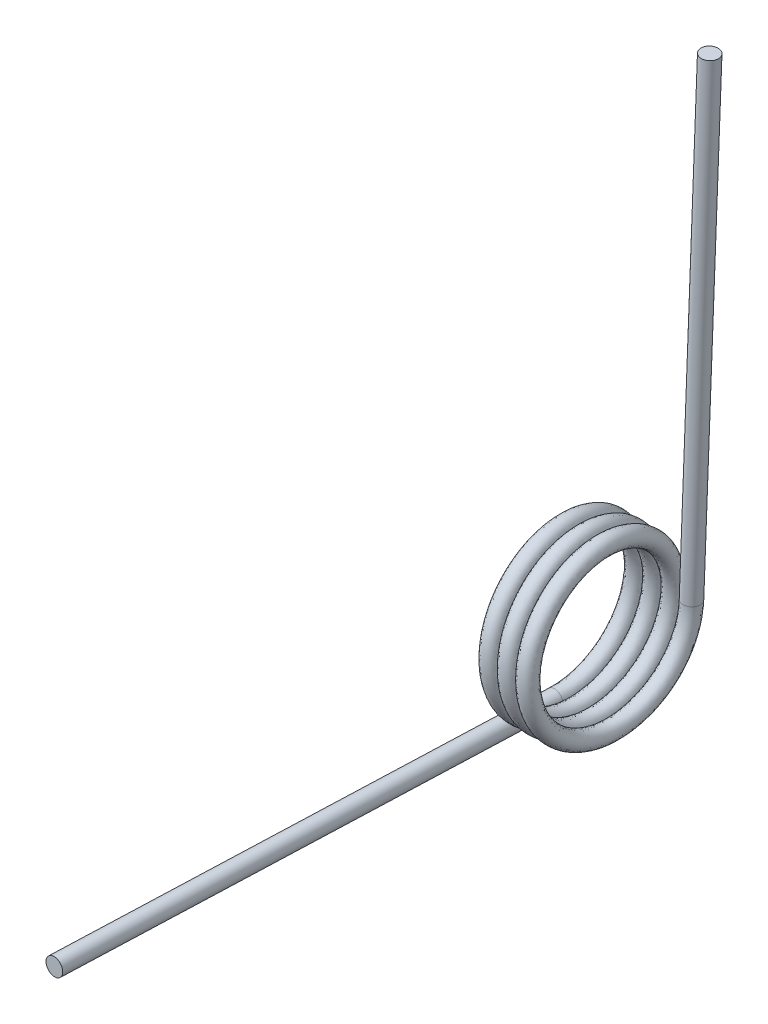
ISO-10303-21;
HEADER;
FILE_DESCRIPTION(('STEP AP214'),'2;1');
FILE_NAME('part.step','',(''),(''),'','','');
FILE_SCHEMA(('AUTOMOTIVE_DESIGN { 1 0 10303 214 1 1 1 1 }'));
ENDSEC;
DATA;
#1=APPLICATION_CONTEXT('core data for automotive mechanical design processes');
#2=APPLICATION_PROTOCOL_DEFINITION('international standard','automotive_design',2000,#1);
#3=PRODUCT_CONTEXT('',#1,'mechanical');
#4=PRODUCT('Part','Part','',(#3));
#5=PRODUCT_RELATED_PRODUCT_CATEGORY('part','',(#4));
#6=PRODUCT_DEFINITION_FORMATION('','',#4);
#7=PRODUCT_DEFINITION_CONTEXT('part definition',#1,'design');
#8=PRODUCT_DEFINITION('design','',#6,#7);
#9=PRODUCT_DEFINITION_SHAPE('','',#8);
#10=(LENGTH_UNIT() NAMED_UNIT(*) SI_UNIT(.MILLI.,.METRE.));
#11=(NAMED_UNIT(*) PLANE_ANGLE_UNIT() SI_UNIT($,.RADIAN.));
#12=(NAMED_UNIT(*) SI_UNIT($,.STERADIAN.) SOLID_ANGLE_UNIT());
#13=UNCERTAINTY_MEASURE_WITH_UNIT(LENGTH_MEASURE(1.E-05),#10,'distance_accuracy_value','');
#14=(GEOMETRIC_REPRESENTATION_CONTEXT(3) GLOBAL_UNCERTAINTY_ASSIGNED_CONTEXT((#13)) GLOBAL_UNIT_ASSIGNED_CONTEXT((#10,
#11,#12)) REPRESENTATION_CONTEXT('',''));
#15=CARTESIAN_POINT('',(0.,0.,0.));
#16=DIRECTION('',(0.,0.,1.));
#17=DIRECTION('',(1.,0.,0.));
#18=AXIS2_PLACEMENT_3D('',#15,#16,#17);
#19=CARTESIAN_POINT('',(-0.228436864439154,-2.032,-0.00863475333799859));
#20=CARTESIAN_POINT('',(-0.188220197772487,-2.02701472283592,-1.18181050033132));
#21=CARTESIAN_POINT('',(-0.148003531105821,-1.00852208425388,-1.76408099715898));
#22=CARTESIAN_POINT('',(-0.107786864439154,0.00997055432815887,-2.34635149398664));
#23=CARTESIAN_POINT('',(-0.0675701977724874,1.02347791574612,-1.75544624382098));
#24=CARTESIAN_POINT('',(-0.0273535311058208,2.03698527716408,-1.16454099365532));
#25=CARTESIAN_POINT('',(0.0128631355608458,2.032,0.00863475333799834));
#26=CARTESIAN_POINT('',(0.0530798022275124,2.02701472283592,1.18181050033132));
#27=CARTESIAN_POINT('',(0.0932964688941789,1.00852208425388,1.76408099715898));
#28=CARTESIAN_POINT('',(0.133513135560846,-0.00997055432815858,2.34635149398664));
#29=CARTESIAN_POINT('',(0.173729802227512,-1.02347791574612,1.75544624382098));
#30=CARTESIAN_POINT('',(0.213946468894179,-2.03698527716408,1.16454099365532));
#31=CARTESIAN_POINT('',(0.254163135560845,-2.032,-0.00863475333799859));
#32=CARTESIAN_POINT('',(0.294379802227512,-2.02701472283592,-1.18181050033132));
#33=CARTESIAN_POINT('',(0.334596468894178,-1.00852208425388,-1.76408099715898));
#34=CARTESIAN_POINT('',(0.374813135560845,0.00997055432815887,-2.34635149398664));
#35=CARTESIAN_POINT('',(0.415029802227512,1.02347791574612,-1.75544624382098));
#36=CARTESIAN_POINT('',(0.455246468894178,2.03698527716408,-1.16454099365532));
#37=CARTESIAN_POINT('',(0.495463135560845,2.032,0.00863475333799834));
#38=CARTESIAN_POINT('',(0.535679802227511,2.02701472283592,1.18181050033132));
#39=CARTESIAN_POINT('',(0.575896468894178,1.00852208425388,1.76408099715898));
#40=CARTESIAN_POINT('',(0.616113135560844,-0.00997055432815858,2.34635149398664));
#41=CARTESIAN_POINT('',(0.656329802227511,-1.02347791574612,1.75544624382098));
#42=CARTESIAN_POINT('',(0.696546468894178,-2.03698527716408,1.16454099365532));
#43=CARTESIAN_POINT('',(0.736763135560844,-2.032,-0.00863475333799859));
#44=CARTESIAN_POINT('',(0.776979802227511,-2.02701472283592,-1.18181050033132));
#45=CARTESIAN_POINT('',(0.817196468894177,-1.00852208425388,-1.76408099715898));
#46=CARTESIAN_POINT('',(0.857413135560844,0.00997055432815887,-2.34635149398664));
#47=CARTESIAN_POINT('',(0.897629802227511,1.02347791574612,-1.75544624382098));
#48=CARTESIAN_POINT('',(0.937846468894177,2.03698527716408,-1.16454099365532));
#49=CARTESIAN_POINT('',(0.978063135560844,2.032,0.00863475333799834));
#50=CARTESIAN_POINT('',(1.01827980222751,2.02701472283592,1.18181050033132));
#51=CARTESIAN_POINT('',(1.05849646889418,1.00852208425388,1.76408099715898));
#52=CARTESIAN_POINT('',(1.09871313556084,-0.00997055432815858,2.34635149398664));
#53=CARTESIAN_POINT('',(1.13892980222751,-1.02347791574612,1.75544624382098));
#54=CARTESIAN_POINT('',(1.17914646889418,-2.03698527716408,1.16454099365532));
#55=CARTESIAN_POINT('',(1.21936313556084,-2.032,-0.00863475333799859));
#56=CARTESIAN_POINT('',(1.25957980222751,-2.02701472283592,-1.18181050033132));
#57=CARTESIAN_POINT('',(1.29979646889418,-1.00852208425388,-1.76408099715898));
#58=CARTESIAN_POINT('',(1.34001313556084,0.00997055432815887,-2.34635149398664));
#59=CARTESIAN_POINT('',(1.38022980222751,1.02347791574612,-1.75544624382098));
#60=CARTESIAN_POINT('',(1.42044646889418,2.03698527716408,-1.16454099365532));
#61=CARTESIAN_POINT('',(1.46066313556084,2.032,0.00863475333799834));
#62=CARTESIAN_POINT('',(1.50087980222751,2.02701472283592,1.18181050033132));
#63=CARTESIAN_POINT('',(1.54109646889418,1.00852208425388,1.76408099715898));
#64=CARTESIAN_POINT('',(1.58131313556084,-0.00997055432815858,2.34635149398664));
#65=CARTESIAN_POINT('',(1.62152980222751,-1.02347791574612,1.75544624382098));
#66=CARTESIAN_POINT('',(1.66174646889418,-2.03698527716408,1.16454099365532));
#67=CARTESIAN_POINT('',(1.70196313556084,-2.032,-0.00863475333799859));
#68=CARTESIAN_POINT('',(-0.228436864439154,-1.5748,-0.00863475333799345));
#69=CARTESIAN_POINT('',(-0.188220197772487,-1.56981472283592,-0.917845957257816));
#70=CARTESIAN_POINT('',(-0.148003531105821,-0.779922084253885,-1.36813418254873));
#71=CARTESIAN_POINT('',(-0.107786864439154,0.00997055432815296,-1.81842240783965));
#72=CARTESIAN_POINT('',(-0.0675701977724875,0.794877915746114,-1.35949942921074));
#73=CARTESIAN_POINT('',(-0.027353531105821,1.57978527716408,-0.90057645058183));
#74=CARTESIAN_POINT('',(0.0128631355608456,1.5748,0.00863475333799325));
#75=CARTESIAN_POINT('',(0.0530798022275122,1.56981472283592,0.917845957257816));
#76=CARTESIAN_POINT('',(0.0932964688941788,0.779922084253886,1.36813418254873));
#77=CARTESIAN_POINT('',(0.133513135560845,-0.00997055432815274,1.81842240783965));
#78=CARTESIAN_POINT('',(0.173729802227512,-0.794877915746114,1.35949942921074));
#79=CARTESIAN_POINT('',(0.213946468894178,-1.57978527716408,0.90057645058183));
#80=CARTESIAN_POINT('',(0.254163135560845,-1.5748,-0.00863475333799345));
#81=CARTESIAN_POINT('',(0.294379802227512,-1.56981472283592,-0.917845957257816));
#82=CARTESIAN_POINT('',(0.334596468894178,-0.779922084253885,-1.36813418254873));
#83=CARTESIAN_POINT('',(0.374813135560845,0.00997055432815296,-1.81842240783965));
#84=CARTESIAN_POINT('',(0.415029802227511,0.794877915746114,-1.35949942921074));
#85=CARTESIAN_POINT('',(0.455246468894178,1.57978527716408,-0.90057645058183));
#86=CARTESIAN_POINT('',(0.495463135560844,1.5748,0.00863475333799325));
#87=CARTESIAN_POINT('',(0.535679802227511,1.56981472283592,0.917845957257816));
#88=CARTESIAN_POINT('',(0.575896468894178,0.779922084253886,1.36813418254873));
#89=CARTESIAN_POINT('',(0.616113135560844,-0.00997055432815274,1.81842240783965));
#90=CARTESIAN_POINT('',(0.656329802227511,-0.794877915746114,1.35949942921074));
#91=CARTESIAN_POINT('',(0.696546468894177,-1.57978527716408,0.90057645058183));
#92=CARTESIAN_POINT('',(0.736763135560844,-1.5748,-0.00863475333799345));
#93=CARTESIAN_POINT('',(0.776979802227511,-1.56981472283592,-0.917845957257816));
#94=CARTESIAN_POINT('',(0.817196468894177,-0.779922084253885,-1.36813418254873));
#95=CARTESIAN_POINT('',(0.857413135560844,0.00997055432815296,-1.81842240783965));
#96=CARTESIAN_POINT('',(0.89762980222751,0.794877915746114,-1.35949942921074));
#97=CARTESIAN_POINT('',(0.937846468894177,1.57978527716408,-0.90057645058183));
#98=CARTESIAN_POINT('',(0.978063135560844,1.5748,0.00863475333799325));
#99=CARTESIAN_POINT('',(1.01827980222751,1.56981472283592,0.917845957257816));
#100=CARTESIAN_POINT('',(1.05849646889418,0.779922084253886,1.36813418254873));
#101=CARTESIAN_POINT('',(1.09871313556084,-0.00997055432815274,1.81842240783965));
#102=CARTESIAN_POINT('',(1.13892980222751,-0.794877915746114,1.35949942921074));
#103=CARTESIAN_POINT('',(1.17914646889418,-1.57978527716408,0.90057645058183));
#104=CARTESIAN_POINT('',(1.21936313556084,-1.5748,-0.00863475333799345));
#105=CARTESIAN_POINT('',(1.25957980222751,-1.56981472283592,-0.917845957257816));
#106=CARTESIAN_POINT('',(1.29979646889418,-0.779922084253885,-1.36813418254873));
#107=CARTESIAN_POINT('',(1.34001313556084,0.00997055432815296,-1.81842240783965));
#108=CARTESIAN_POINT('',(1.38022980222751,0.794877915746114,-1.35949942921074));
#109=CARTESIAN_POINT('',(1.42044646889418,1.57978527716408,-0.90057645058183));
#110=CARTESIAN_POINT('',(1.46066313556084,1.5748,0.00863475333799325));
#111=CARTESIAN_POINT('',(1.50087980222751,1.56981472283592,0.917845957257816));
#112=CARTESIAN_POINT('',(1.54109646889418,0.779922084253886,1.36813418254873));
#113=CARTESIAN_POINT('',(1.58131313556084,-0.00997055432815274,1.81842240783965));
#114=CARTESIAN_POINT('',(1.62152980222751,-0.794877915746114,1.35949942921074));
#115=CARTESIAN_POINT('',(1.66174646889418,-1.57978527716408,0.90057645058183));
#116=CARTESIAN_POINT('',(1.70196313556084,-1.5748,-0.00863475333799345));
#117=CARTESIAN_POINT('',(0.228436864439154,-1.5748,0.00863475333796116));
#118=CARTESIAN_POINT('',(0.26865353110582,-1.57978527716406,-0.900576450581861));
#119=CARTESIAN_POINT('',(0.308870197772487,-0.794877915746087,-1.35949942921075));
#120=CARTESIAN_POINT('',(0.349086864439153,-0.00997055432811591,-1.81842240783965));
#121=CARTESIAN_POINT('',(0.38930353110582,0.779922084253913,-1.36813418254871));
#122=CARTESIAN_POINT('',(0.429520197772486,1.56981472283594,-0.917845957257784));
#123=CARTESIAN_POINT('',(0.469736864439153,1.5748,-0.00863475333796136));
#124=CARTESIAN_POINT('',(0.50995353110582,1.57978527716406,0.900576450581861));
#125=CARTESIAN_POINT('',(0.550170197772486,0.794877915746087,1.35949942921075));
#126=CARTESIAN_POINT('',(0.590386864439153,0.00997055432811613,1.81842240783965));
#127=CARTESIAN_POINT('',(0.630603531105819,-0.779922084253912,1.36813418254871));
#128=CARTESIAN_POINT('',(0.670820197772486,-1.56981472283594,0.917845957257785));
#129=CARTESIAN_POINT('',(0.711036864439152,-1.5748,0.00863475333796116));
#130=CARTESIAN_POINT('',(0.751253531105819,-1.57978527716406,-0.900576450581861));
#131=CARTESIAN_POINT('',(0.791470197772486,-0.794877915746087,-1.35949942921075));
#132=CARTESIAN_POINT('',(0.831686864439152,-0.00997055432811591,-1.81842240783965));
#133=CARTESIAN_POINT('',(0.871903531105819,0.779922084253913,-1.36813418254871));
#134=CARTESIAN_POINT('',(0.912120197772485,1.56981472283594,-0.917845957257784));
#135=CARTESIAN_POINT('',(0.952336864439152,1.5748,-0.00863475333796136));
#136=CARTESIAN_POINT('',(0.992553531105819,1.57978527716406,0.900576450581861));
#137=CARTESIAN_POINT('',(1.03277019777249,0.794877915746087,1.35949942921075));
#138=CARTESIAN_POINT('',(1.07298686443915,0.00997055432811613,1.81842240783965));
#139=CARTESIAN_POINT('',(1.11320353110582,-0.779922084253912,1.36813418254871));
#140=CARTESIAN_POINT('',(1.15342019777248,-1.56981472283594,0.917845957257785));
#141=CARTESIAN_POINT('',(1.19363686443915,-1.5748,0.00863475333796116));
#142=CARTESIAN_POINT('',(1.23385353110582,-1.57978527716406,-0.900576450581861));
#143=CARTESIAN_POINT('',(1.27407019777248,-0.794877915746087,-1.35949942921075));
#144=CARTESIAN_POINT('',(1.31428686443915,-0.00997055432811591,-1.81842240783965));
#145=CARTESIAN_POINT('',(1.35450353110582,0.779922084253913,-1.36813418254871));
#146=CARTESIAN_POINT('',(1.39472019777248,1.56981472283594,-0.917845957257784));
#147=CARTESIAN_POINT('',(1.43493686443915,1.5748,-0.00863475333796136));
#148=CARTESIAN_POINT('',(1.47515353110582,1.57978527716406,0.900576450581861));
#149=CARTESIAN_POINT('',(1.51537019777248,0.794877915746087,1.35949942921075));
#150=CARTESIAN_POINT('',(1.55558686443915,0.00997055432811613,1.81842240783965));
#151=CARTESIAN_POINT('',(1.59580353110582,-0.779922084253912,1.36813418254871));
#152=CARTESIAN_POINT('',(1.63602019777248,-1.56981472283594,0.917845957257785));
#153=CARTESIAN_POINT('',(1.67623686443915,-1.5748,0.00863475333796116));
#154=CARTESIAN_POINT('',(1.71645353110582,-1.57978527716406,-0.900576450581861));
#155=CARTESIAN_POINT('',(1.75667019777248,-0.794877915746087,-1.35949942921075));
#156=CARTESIAN_POINT('',(1.79688686443915,-0.00997055432811591,-1.81842240783965));
#157=CARTESIAN_POINT('',(1.83710353110582,0.779922084253913,-1.36813418254871));
#158=CARTESIAN_POINT('',(1.87732019777248,1.56981472283594,-0.917845957257784));
#159=CARTESIAN_POINT('',(1.91753686443915,1.5748,-0.00863475333796136));
#160=CARTESIAN_POINT('',(1.95775353110582,1.57978527716406,0.900576450581861));
#161=CARTESIAN_POINT('',(1.99797019777248,0.794877915746087,1.35949942921075));
#162=CARTESIAN_POINT('',(2.03818686443915,0.00997055432811613,1.81842240783965));
#163=CARTESIAN_POINT('',(2.07840353110582,-0.779922084253912,1.36813418254871));
#164=CARTESIAN_POINT('',(2.11862019777248,-1.56981472283594,0.917845957257785));
#165=CARTESIAN_POINT('',(2.15883686443915,-1.5748,0.00863475333796116));
#166=CARTESIAN_POINT('',(0.228436864439154,-2.032,0.00863475333795602));
#167=CARTESIAN_POINT('',(0.26865353110582,-2.03698527716405,-1.16454099365536));
#168=CARTESIAN_POINT('',(0.308870197772487,-1.02347791574608,-1.755446243821));
#169=CARTESIAN_POINT('',(0.349086864439153,-0.00997055432811,-2.34635149398664));
#170=CARTESIAN_POINT('',(0.38930353110582,1.00852208425392,-1.76408099715896));
#171=CARTESIAN_POINT('',(0.429520197772487,2.02701472283594,-1.18181050033128));
#172=CARTESIAN_POINT('',(0.469736864439153,2.032,-0.00863475333795627));
#173=CARTESIAN_POINT('',(0.50995353110582,2.03698527716406,1.16454099365536));
#174=CARTESIAN_POINT('',(0.550170197772486,1.02347791574608,1.755446243821));
#175=CARTESIAN_POINT('',(0.590386864439153,0.00997055432811028,2.34635149398664));
#176=CARTESIAN_POINT('',(0.630603531105819,-1.00852208425392,1.76408099715896));
#177=CARTESIAN_POINT('',(0.670820197772486,-2.02701472283594,1.18181050033128));
#178=CARTESIAN_POINT('',(0.711036864439153,-2.032,0.00863475333795602));
#179=CARTESIAN_POINT('',(0.751253531105819,-2.03698527716405,-1.16454099365536));
#180=CARTESIAN_POINT('',(0.791470197772486,-1.02347791574608,-1.755446243821));
#181=CARTESIAN_POINT('',(0.831686864439152,-0.00997055432811,-2.34635149398664));
#182=CARTESIAN_POINT('',(0.871903531105819,1.00852208425392,-1.76408099715896));
#183=CARTESIAN_POINT('',(0.912120197772485,2.02701472283594,-1.18181050033128));
#184=CARTESIAN_POINT('',(0.952336864439152,2.032,-0.00863475333795627));
#185=CARTESIAN_POINT('',(0.992553531105819,2.03698527716406,1.16454099365536));
#186=CARTESIAN_POINT('',(1.03277019777249,1.02347791574608,1.755446243821));
#187=CARTESIAN_POINT('',(1.07298686443915,0.00997055432811028,2.34635149398664));
#188=CARTESIAN_POINT('',(1.11320353110582,-1.00852208425392,1.76408099715896));
#189=CARTESIAN_POINT('',(1.15342019777248,-2.02701472283594,1.18181050033128));
#190=CARTESIAN_POINT('',(1.19363686443915,-2.032,0.00863475333795602));
#191=CARTESIAN_POINT('',(1.23385353110582,-2.03698527716405,-1.16454099365536));
#192=CARTESIAN_POINT('',(1.27407019777248,-1.02347791574608,-1.755446243821));
#193=CARTESIAN_POINT('',(1.31428686443915,-0.00997055432811,-2.34635149398664));
#194=CARTESIAN_POINT('',(1.35450353110582,1.00852208425392,-1.76408099715896));
#195=CARTESIAN_POINT('',(1.39472019777248,2.02701472283594,-1.18181050033128));
#196=CARTESIAN_POINT('',(1.43493686443915,2.032,-0.00863475333795627));
#197=CARTESIAN_POINT('',(1.47515353110582,2.03698527716406,1.16454099365536));
#198=CARTESIAN_POINT('',(1.51537019777248,1.02347791574608,1.755446243821));
#199=CARTESIAN_POINT('',(1.55558686443915,0.00997055432811028,2.34635149398664));
#200=CARTESIAN_POINT('',(1.59580353110582,-1.00852208425392,1.76408099715896));
#201=CARTESIAN_POINT('',(1.63602019777248,-2.02701472283594,1.18181050033128));
#202=CARTESIAN_POINT('',(1.67623686443915,-2.032,0.00863475333795602));
#203=CARTESIAN_POINT('',(1.71645353110582,-2.03698527716405,-1.16454099365536));
#204=CARTESIAN_POINT('',(1.75667019777248,-1.02347791574608,-1.755446243821));
#205=CARTESIAN_POINT('',(1.79688686443915,-0.00997055432811,-2.34635149398664));
#206=CARTESIAN_POINT('',(1.83710353110582,1.00852208425392,-1.76408099715896));
#207=CARTESIAN_POINT('',(1.87732019777248,2.02701472283594,-1.18181050033128));
#208=CARTESIAN_POINT('',(1.91753686443915,2.032,-0.00863475333795627));
#209=CARTESIAN_POINT('',(1.95775353110582,2.03698527716406,1.16454099365536));
#210=CARTESIAN_POINT('',(1.99797019777248,1.02347791574608,1.755446243821));
#211=CARTESIAN_POINT('',(2.03818686443915,0.00997055432811028,2.34635149398664));
#212=CARTESIAN_POINT('',(2.07840353110582,-1.00852208425392,1.76408099715896));
#213=CARTESIAN_POINT('',(2.11862019777248,-2.02701472283594,1.18181050033128));
#214=CARTESIAN_POINT('',(2.15883686443915,-2.032,0.00863475333795602));
#215=CARTESIAN_POINT('',(0.228436864439154,-2.4892,0.00863475333795088));
#216=CARTESIAN_POINT('',(0.268653531105821,-2.49418527716405,-1.42850553672887));
#217=CARTESIAN_POINT('',(0.308870197772487,-1.25207791574608,-2.15139305843125));
#218=CARTESIAN_POINT('',(0.349086864439154,-0.00997055432810409,-2.87428058013363));
#219=CARTESIAN_POINT('',(0.38930353110582,1.23712208425392,-2.1600278117692));
#220=CARTESIAN_POINT('',(0.429520197772487,2.48421472283595,-1.44577504340477));
#221=CARTESIAN_POINT('',(0.469736864439154,2.4892,-0.00863475333795118));
#222=CARTESIAN_POINT('',(0.50995353110582,2.49418527716405,1.42850553672887));
#223=CARTESIAN_POINT('',(0.550170197772487,1.25207791574608,2.15139305843125));
#224=CARTESIAN_POINT('',(0.590386864439153,0.00997055432810444,2.87428058013363));
#225=CARTESIAN_POINT('',(0.63060353110582,-1.23712208425392,2.1600278117692));
#226=CARTESIAN_POINT('',(0.670820197772486,-2.48421472283595,1.44577504340477));
#227=CARTESIAN_POINT('',(0.711036864439153,-2.4892,0.00863475333795088));
#228=CARTESIAN_POINT('',(0.751253531105819,-2.49418527716405,-1.42850553672887));
#229=CARTESIAN_POINT('',(0.791470197772486,-1.25207791574608,-2.15139305843125));
#230=CARTESIAN_POINT('',(0.831686864439153,-0.00997055432810409,-2.87428058013363));
#231=CARTESIAN_POINT('',(0.871903531105819,1.23712208425392,-2.1600278117692));
#232=CARTESIAN_POINT('',(0.912120197772486,2.48421472283595,-1.44577504340477));
#233=CARTESIAN_POINT('',(0.952336864439152,2.4892,-0.00863475333795118));
#234=CARTESIAN_POINT('',(0.992553531105819,2.49418527716405,1.42850553672887));
#235=CARTESIAN_POINT('',(1.03277019777249,1.25207791574608,2.15139305843125));
#236=CARTESIAN_POINT('',(1.07298686443915,0.00997055432810444,2.87428058013363));
#237=CARTESIAN_POINT('',(1.11320353110582,-1.23712208425392,2.1600278117692));
#238=CARTESIAN_POINT('',(1.15342019777249,-2.48421472283595,1.44577504340477));
#239=CARTESIAN_POINT('',(1.19363686443915,-2.4892,0.00863475333795088));
#240=CARTESIAN_POINT('',(1.23385353110582,-2.49418527716405,-1.42850553672887));
#241=CARTESIAN_POINT('',(1.27407019777249,-1.25207791574608,-2.15139305843125));
#242=CARTESIAN_POINT('',(1.31428686443915,-0.00997055432810409,-2.87428058013363));
#243=CARTESIAN_POINT('',(1.35450353110582,1.23712208425392,-2.1600278117692));
#244=CARTESIAN_POINT('',(1.39472019777249,2.48421472283595,-1.44577504340477));
#245=CARTESIAN_POINT('',(1.43493686443915,2.4892,-0.00863475333795118));
#246=CARTESIAN_POINT('',(1.47515353110582,2.49418527716405,1.42850553672887));
#247=CARTESIAN_POINT('',(1.51537019777248,1.25207791574608,2.15139305843125));
#248=CARTESIAN_POINT('',(1.55558686443915,0.00997055432810444,2.87428058013363));
#249=CARTESIAN_POINT('',(1.59580353110582,-1.23712208425392,2.1600278117692));
#250=CARTESIAN_POINT('',(1.63602019777248,-2.48421472283595,1.44577504340477));
#251=CARTESIAN_POINT('',(1.67623686443915,-2.4892,0.00863475333795088));
#252=CARTESIAN_POINT('',(1.71645353110582,-2.49418527716405,-1.42850553672887));
#253=CARTESIAN_POINT('',(1.75667019777248,-1.25207791574608,-2.15139305843125));
#254=CARTESIAN_POINT('',(1.79688686443915,-0.00997055432810409,-2.87428058013363));
#255=CARTESIAN_POINT('',(1.83710353110582,1.23712208425392,-2.1600278117692));
#256=CARTESIAN_POINT('',(1.87732019777248,2.48421472283595,-1.44577504340477));
#257=CARTESIAN_POINT('',(1.91753686443915,2.4892,-0.00863475333795118));
#258=CARTESIAN_POINT('',(1.95775353110582,2.49418527716405,1.42850553672887));
#259=CARTESIAN_POINT('',(1.99797019777248,1.25207791574608,2.15139305843125));
#260=CARTESIAN_POINT('',(2.03818686443915,0.00997055432810444,2.87428058013363));
#261=CARTESIAN_POINT('',(2.07840353110582,-1.23712208425392,2.1600278117692));
#262=CARTESIAN_POINT('',(2.11862019777248,-2.48421472283595,1.44577504340477));
#263=CARTESIAN_POINT('',(2.15883686443915,-2.4892,0.00863475333795088));
#264=CARTESIAN_POINT('',(-0.228436864439154,-2.4892,-0.00863475333800374));
#265=CARTESIAN_POINT('',(-0.188220197772487,-2.48421472283592,-1.44577504340482));
#266=CARTESIAN_POINT('',(-0.14800353110582,-1.23712208425388,-2.16002781176923));
#267=CARTESIAN_POINT('',(-0.107786864439154,0.00997055432816478,-2.87428058013363));
#268=CARTESIAN_POINT('',(-0.0675701977724872,1.25207791574612,-2.15139305843122));
#269=CARTESIAN_POINT('',(-0.0273535311058206,2.49418527716408,-1.42850553672881));
#270=CARTESIAN_POINT('',(0.012863135560846,2.4892,0.00863475333800343));
#271=CARTESIAN_POINT('',(0.0530798022275125,2.48421472283592,1.44577504340482));
#272=CARTESIAN_POINT('',(0.0932964688941791,1.23712208425388,2.16002781176923));
#273=CARTESIAN_POINT('',(0.133513135560846,-0.00997055432816442,2.87428058013363));
#274=CARTESIAN_POINT('',(0.173729802227512,-1.25207791574612,2.15139305843122));
#275=CARTESIAN_POINT('',(0.213946468894179,-2.49418527716408,1.42850553672881));
#276=CARTESIAN_POINT('',(0.254163135560845,-2.4892,-0.00863475333800374));
#277=CARTESIAN_POINT('',(0.294379802227512,-2.48421472283592,-1.44577504340482));
#278=CARTESIAN_POINT('',(0.334596468894179,-1.23712208425388,-2.16002781176923));
#279=CARTESIAN_POINT('',(0.374813135560845,0.00997055432816478,-2.87428058013363));
#280=CARTESIAN_POINT('',(0.415029802227512,1.25207791574612,-2.15139305843122));
#281=CARTESIAN_POINT('',(0.455246468894178,2.49418527716408,-1.42850553672881));
#282=CARTESIAN_POINT('',(0.495463135560845,2.4892,0.00863475333800343));
#283=CARTESIAN_POINT('',(0.535679802227511,2.48421472283592,1.44577504340482));
#284=CARTESIAN_POINT('',(0.575896468894178,1.23712208425388,2.16002781176923));
#285=CARTESIAN_POINT('',(0.616113135560845,-0.00997055432816442,2.87428058013363));
#286=CARTESIAN_POINT('',(0.656329802227511,-1.25207791574612,2.15139305843122));
#287=CARTESIAN_POINT('',(0.696546468894178,-2.49418527716408,1.42850553672881));
#288=CARTESIAN_POINT('',(0.736763135560844,-2.4892,-0.00863475333800374));
#289=CARTESIAN_POINT('',(0.776979802227511,-2.48421472283592,-1.44577504340482));
#290=CARTESIAN_POINT('',(0.817196468894177,-1.23712208425388,-2.16002781176923));
#291=CARTESIAN_POINT('',(0.857413135560844,0.00997055432816478,-2.87428058013363));
#292=CARTESIAN_POINT('',(0.897629802227511,1.25207791574612,-2.15139305843122));
#293=CARTESIAN_POINT('',(0.937846468894177,2.49418527716408,-1.42850553672881));
#294=CARTESIAN_POINT('',(0.978063135560844,2.4892,0.00863475333800343));
#295=CARTESIAN_POINT('',(1.01827980222751,2.48421472283592,1.44577504340482));
#296=CARTESIAN_POINT('',(1.05849646889418,1.23712208425388,2.16002781176923));
#297=CARTESIAN_POINT('',(1.09871313556084,-0.00997055432816442,2.87428058013363));
#298=CARTESIAN_POINT('',(1.13892980222751,-1.25207791574612,2.15139305843122));
#299=CARTESIAN_POINT('',(1.17914646889418,-2.49418527716408,1.42850553672881));
#300=CARTESIAN_POINT('',(1.21936313556084,-2.4892,-0.00863475333800374));
#301=CARTESIAN_POINT('',(1.25957980222751,-2.48421472283592,-1.44577504340482));
#302=CARTESIAN_POINT('',(1.29979646889418,-1.23712208425388,-2.16002781176923));
#303=CARTESIAN_POINT('',(1.34001313556084,0.00997055432816478,-2.87428058013363));
#304=CARTESIAN_POINT('',(1.38022980222751,1.25207791574612,-2.15139305843122));
#305=CARTESIAN_POINT('',(1.42044646889418,2.49418527716408,-1.42850553672881));
#306=CARTESIAN_POINT('',(1.46066313556084,2.4892,0.00863475333800343));
#307=CARTESIAN_POINT('',(1.50087980222751,2.48421472283592,1.44577504340482));
#308=CARTESIAN_POINT('',(1.54109646889418,1.23712208425388,2.16002781176923));
#309=CARTESIAN_POINT('',(1.58131313556084,-0.00997055432816442,2.87428058013363));
#310=CARTESIAN_POINT('',(1.62152980222751,-1.25207791574612,2.15139305843122));
#311=CARTESIAN_POINT('',(1.66174646889418,-2.49418527716408,1.42850553672881));
#312=CARTESIAN_POINT('',(1.70196313556084,-2.4892,-0.00863475333800374));
#313=CARTESIAN_POINT('',(-0.228436864439154,-2.032,-0.00863475333799859));
#314=CARTESIAN_POINT('',(-0.188220197772487,-2.02701472283592,-1.18181050033132));
#315=CARTESIAN_POINT('',(-0.148003531105821,-1.00852208425388,-1.76408099715898));
#316=CARTESIAN_POINT('',(-0.107786864439154,0.00997055432815887,-2.34635149398664));
#317=CARTESIAN_POINT('',(-0.0675701977724874,1.02347791574612,-1.75544624382098));
#318=CARTESIAN_POINT('',(-0.0273535311058208,2.03698527716408,-1.16454099365532));
#319=CARTESIAN_POINT('',(0.0128631355608458,2.032,0.00863475333799834));
#320=CARTESIAN_POINT('',(0.0530798022275124,2.02701472283592,1.18181050033132));
#321=CARTESIAN_POINT('',(0.0932964688941789,1.00852208425388,1.76408099715898));
#322=CARTESIAN_POINT('',(0.133513135560846,-0.00997055432815858,2.34635149398664));
#323=CARTESIAN_POINT('',(0.173729802227512,-1.02347791574612,1.75544624382098));
#324=CARTESIAN_POINT('',(0.213946468894179,-2.03698527716408,1.16454099365532));
#325=CARTESIAN_POINT('',(0.254163135560845,-2.032,-0.00863475333799859));
#326=CARTESIAN_POINT('',(0.294379802227512,-2.02701472283592,-1.18181050033132));
#327=CARTESIAN_POINT('',(0.334596468894178,-1.00852208425388,-1.76408099715898));
#328=CARTESIAN_POINT('',(0.374813135560845,0.00997055432815887,-2.34635149398664));
#329=CARTESIAN_POINT('',(0.415029802227512,1.02347791574612,-1.75544624382098));
#330=CARTESIAN_POINT('',(0.455246468894178,2.03698527716408,-1.16454099365532));
#331=CARTESIAN_POINT('',(0.495463135560845,2.032,0.00863475333799834));
#332=CARTESIAN_POINT('',(0.535679802227511,2.02701472283592,1.18181050033132));
#333=CARTESIAN_POINT('',(0.575896468894178,1.00852208425388,1.76408099715898));
#334=CARTESIAN_POINT('',(0.616113135560844,-0.00997055432815858,2.34635149398664));
#335=CARTESIAN_POINT('',(0.656329802227511,-1.02347791574612,1.75544624382098));
#336=CARTESIAN_POINT('',(0.696546468894178,-2.03698527716408,1.16454099365532));
#337=CARTESIAN_POINT('',(0.736763135560844,-2.032,-0.00863475333799859));
#338=CARTESIAN_POINT('',(0.776979802227511,-2.02701472283592,-1.18181050033132));
#339=CARTESIAN_POINT('',(0.817196468894177,-1.00852208425388,-1.76408099715898));
#340=CARTESIAN_POINT('',(0.857413135560844,0.00997055432815887,-2.34635149398664));
#341=CARTESIAN_POINT('',(0.897629802227511,1.02347791574612,-1.75544624382098));
#342=CARTESIAN_POINT('',(0.937846468894177,2.03698527716408,-1.16454099365532));
#343=CARTESIAN_POINT('',(0.978063135560844,2.032,0.00863475333799834));
#344=CARTESIAN_POINT('',(1.01827980222751,2.02701472283592,1.18181050033132));
#345=CARTESIAN_POINT('',(1.05849646889418,1.00852208425388,1.76408099715898));
#346=CARTESIAN_POINT('',(1.09871313556084,-0.00997055432815858,2.34635149398664));
#347=CARTESIAN_POINT('',(1.13892980222751,-1.02347791574612,1.75544624382098));
#348=CARTESIAN_POINT('',(1.17914646889418,-2.03698527716408,1.16454099365532));
#349=CARTESIAN_POINT('',(1.21936313556084,-2.032,-0.00863475333799859));
#350=CARTESIAN_POINT('',(1.25957980222751,-2.02701472283592,-1.18181050033132));
#351=CARTESIAN_POINT('',(1.29979646889418,-1.00852208425388,-1.76408099715898));
#352=CARTESIAN_POINT('',(1.34001313556084,0.00997055432815887,-2.34635149398664));
#353=CARTESIAN_POINT('',(1.38022980222751,1.02347791574612,-1.75544624382098));
#354=CARTESIAN_POINT('',(1.42044646889418,2.03698527716408,-1.16454099365532));
#355=CARTESIAN_POINT('',(1.46066313556084,2.032,0.00863475333799834));
#356=CARTESIAN_POINT('',(1.50087980222751,2.02701472283592,1.18181050033132));
#357=CARTESIAN_POINT('',(1.54109646889418,1.00852208425388,1.76408099715898));
#358=CARTESIAN_POINT('',(1.58131313556084,-0.00997055432815858,2.34635149398664));
#359=CARTESIAN_POINT('',(1.62152980222751,-1.02347791574612,1.75544624382098));
#360=CARTESIAN_POINT('',(1.66174646889418,-2.03698527716408,1.16454099365532));
#361=CARTESIAN_POINT('',(1.70196313556084,-2.032,-0.00863475333799859));
#362=(BOUNDED_SURFACE() B_SPLINE_SURFACE(3,2,((#19,#20,#21,#22,#23,#24,#25,#26,#27,#28,#29,#30,
#31,#32,#33,#34,#35,#36,#37,#38,#39,#40,#41,#42,#43,#44,#45,#46,#47,#48,#49,#50,#51,#52,#53,#54,
#55,#56,#57,#58,#59,#60,#61,#62,#63,#64,#65,#66,#67),(#68,#69,#70,#71,#72,#73,#74,#75,#76,#77,
#78,#79,#80,#81,#82,#83,#84,#85,#86,#87,#88,#89,#90,#91,#92,#93,#94,#95,#96,#97,#98,#99,#100,
#101,#102,#103,#104,#105,#106,#107,#108,#109,#110,#111,#112,#113,#114,#115,#116),(#117,#118,
#119,#120,#121,#122,#123,#124,#125,#126,#127,#128,#129,#130,#131,#132,#133,#134,#135,#136,#137,
#138,#139,#140,#141,#142,#143,#144,#145,#146,#147,#148,#149,#150,#151,#152,#153,#154,#155,#156,
#157,#158,#159,#160,#161,#162,#163,#164,#165),(#166,#167,#168,#169,#170,#171,#172,#173,#174,
#175,#176,#177,#178,#179,#180,#181,#182,#183,#184,#185,#186,#187,#188,#189,#190,#191,#192,#193,
#194,#195,#196,#197,#198,#199,#200,#201,#202,#203,#204,#205,#206,#207,#208,#209,#210,#211,#212,
#213,#214),(#215,#216,#217,#218,#219,#220,#221,#222,#223,#224,#225,#226,#227,#228,#229,#230,
#231,#232,#233,#234,#235,#236,#237,#238,#239,#240,#241,#242,#243,#244,#245,#246,#247,#248,#249,
#250,#251,#252,#253,#254,#255,#256,#257,#258,#259,#260,#261,#262,#263),(#264,#265,#266,#267,
#268,#269,#270,#271,#272,#273,#274,#275,#276,#277,#278,#279,#280,#281,#282,#283,#284,#285,#286,
#287,#288,#289,#290,#291,#292,#293,#294,#295,#296,#297,#298,#299,#300,#301,#302,#303,#304,#305,
#306,#307,#308,#309,#310,#311,#312),(#313,#314,#315,#316,#317,#318,#319,#320,#321,#322,#323,
#324,#325,#326,#327,#328,#329,#330,#331,#332,#333,#334,#335,#336,#337,#338,#339,#340,#341,#342,
#343,#344,#345,#346,#347,#348,#349,#350,#351,#352,#353,#354,#355,#356,#357,#358,#359,#360,
#361)),.UNSPECIFIED.,.T.,.F.,.F.) B_SPLINE_SURFACE_WITH_KNOTS((4,3,4),(3,2,2,2,2,2,2,2,2,2,2,2,
2,2,2,2,2,2,2,2,2,2,2,2,3),(0.,0.5,1.),(0.,0.0416666666666667,0.0833333333333333,0.125,
0.166666666666667,0.208333333333333,0.25,0.291666666666667,0.333333333333333,0.375,
0.416666666666667,0.458333333333333,0.5,0.541666666666667,0.583333333333333,0.625,
0.666666666666667,0.708333333333333,0.75,0.791666666666667,0.833333333333333,0.875,
0.916666666666667,0.958333333333333,1.),
.UNSPECIFIED.) GEOMETRIC_REPRESENTATION_ITEM() RATIONAL_B_SPLINE_SURFACE(((1.,0.866025403784439,
1.,0.866025403784439,1.,0.866025403784439,1.,0.866025403784439,1.,0.866025403784439,1.,
0.866025403784439,1.,0.866025403784439,1.,0.866025403784439,1.,0.866025403784439,1.,
0.866025403784439,1.,0.866025403784439,1.,0.866025403784439,1.,0.866025403784439,1.,
0.866025403784439,1.,0.866025403784439,1.,0.866025403784439,1.,0.866025403784439,1.,
0.866025403784439,1.,0.866025403784439,1.,0.866025403784439,1.,0.866025403784439,1.,
0.866025403784439,1.,0.866025403784439,1.,0.866025403784439,1.),(0.333333333333333,
0.288675134594813,0.333333333333333,0.288675134594813,0.333333333333333,0.288675134594813,
0.333333333333333,0.288675134594813,0.333333333333333,0.288675134594813,0.333333333333333,
0.288675134594813,0.333333333333333,0.288675134594813,0.333333333333333,0.288675134594813,
0.333333333333333,0.288675134594813,0.333333333333333,0.288675134594813,0.333333333333333,
0.288675134594813,0.333333333333333,0.288675134594813,0.333333333333333,0.288675134594813,
0.333333333333333,0.288675134594813,0.333333333333333,0.288675134594813,0.333333333333333,
0.288675134594813,0.333333333333333,0.288675134594813,0.333333333333333,0.288675134594813,
0.333333333333333,0.288675134594813,0.333333333333333,0.288675134594813,0.333333333333333,
0.288675134594813,0.333333333333333,0.288675134594813,0.333333333333333,0.288675134594813,
0.333333333333333,0.288675134594813,0.333333333333333),(0.333333333333333,0.288675134594813,
0.333333333333333,0.288675134594813,0.333333333333333,0.288675134594813,0.333333333333333,
0.288675134594813,0.333333333333333,0.288675134594813,0.333333333333333,0.288675134594813,
0.333333333333333,0.288675134594813,0.333333333333333,0.288675134594813,0.333333333333333,
0.288675134594813,0.333333333333333,0.288675134594813,0.333333333333333,0.288675134594813,
0.333333333333333,0.288675134594813,0.333333333333333,0.288675134594813,0.333333333333333,
0.288675134594813,0.333333333333333,0.288675134594813,0.333333333333333,0.288675134594813,
0.333333333333333,0.288675134594813,0.333333333333333,0.288675134594813,0.333333333333333,
0.288675134594813,0.333333333333333,0.288675134594813,0.333333333333333,0.288675134594813,
0.333333333333333,0.288675134594813,0.333333333333333,0.288675134594813,0.333333333333333,
0.288675134594813,0.333333333333333),(1.,0.866025403784439,1.,0.866025403784439,1.,
0.866025403784439,1.,0.866025403784439,1.,0.866025403784439,1.,0.866025403784439,1.,
0.866025403784439,1.,0.866025403784439,1.,0.866025403784439,1.,0.866025403784439,1.,
0.866025403784439,1.,0.866025403784439,1.,0.866025403784439,1.,0.866025403784439,1.,
0.866025403784439,1.,0.866025403784439,1.,0.866025403784439,1.,0.866025403784439,1.,
0.866025403784439,1.,0.866025403784439,1.,0.866025403784439,1.,0.866025403784439,1.,
0.866025403784439,1.,0.866025403784439,1.),(0.333333333333333,0.288675134594813,
0.333333333333333,0.288675134594813,0.333333333333333,0.288675134594813,0.333333333333333,
0.288675134594813,0.333333333333333,0.288675134594813,0.333333333333333,0.288675134594813,
0.333333333333333,0.288675134594813,0.333333333333333,0.288675134594813,0.333333333333333,
0.288675134594813,0.333333333333333,0.288675134594813,0.333333333333333,0.288675134594813,
0.333333333333333,0.288675134594813,0.333333333333333,0.288675134594813,0.333333333333333,
0.288675134594813,0.333333333333333,0.288675134594813,0.333333333333333,0.288675134594813,
0.333333333333333,0.288675134594813,0.333333333333333,0.288675134594813,0.333333333333333,
0.288675134594813,0.333333333333333,0.288675134594813,0.333333333333333,0.288675134594813,
0.333333333333333,0.288675134594813,0.333333333333333,0.288675134594813,0.333333333333333,
0.288675134594813,0.333333333333333),(0.333333333333333,0.288675134594813,0.333333333333333,
0.288675134594813,0.333333333333333,0.288675134594813,0.333333333333333,0.288675134594813,
0.333333333333333,0.288675134594813,0.333333333333333,0.288675134594813,0.333333333333333,
0.288675134594813,0.333333333333333,0.288675134594813,0.333333333333333,0.288675134594813,
0.333333333333333,0.288675134594813,0.333333333333333,0.288675134594813,0.333333333333333,
0.288675134594813,0.333333333333333,0.288675134594813,0.333333333333333,0.288675134594813,
0.333333333333333,0.288675134594813,0.333333333333333,0.288675134594813,0.333333333333333,
0.288675134594813,0.333333333333333,0.288675134594813,0.333333333333333,0.288675134594813,
0.333333333333333,0.288675134594813,0.333333333333333,0.288675134594813,0.333333333333333,
0.288675134594813,0.333333333333333,0.288675134594813,0.333333333333333,0.288675134594813,
0.333333333333333),(1.,0.866025403784439,1.,0.866025403784439,1.,0.866025403784439,1.,
0.866025403784439,1.,0.866025403784439,1.,0.866025403784439,1.,0.866025403784439,1.,
0.866025403784439,1.,0.866025403784439,1.,0.866025403784439,1.,0.866025403784439,1.,
0.866025403784439,1.,0.866025403784439,1.,0.866025403784439,1.,0.866025403784439,1.,
0.866025403784439,1.,0.866025403784439,1.,0.866025403784439,1.,0.866025403784439,1.,
0.866025403784439,1.,0.866025403784439,1.,0.866025403784439,1.,0.866025403784439,1.,
0.866025403784439,1.))) REPRESENTATION_ITEM('') SURFACE());
#363=CARTESIAN_POINT('',(1.56845,1.0990780263511E-13,-2.032));
#364=DIRECTION('',(0.0377723243131116,0.999286371124907,0.));
#365=DIRECTION('',(-0.999286371124907,0.0377723243131116,0.));
#366=AXIS2_PLACEMENT_3D('',#363,#364,#365);
#367=CIRCLE('',#366,0.2286);
#368=CARTESIAN_POINT('',(1.34001313556085,0.00863475333808721,-2.032));
#369=VERTEX_POINT('',#368);
#370=EDGE_CURVE('E10',#369,#369,#367,.T.);
#371=CARTESIAN_POINT('',(0.,-2.032,0.));
#372=DIRECTION('',(0.0377723243131116,0.,-0.999286371124907));
#373=DIRECTION('',(-0.999286371124907,0.,-0.0377723243131116));
#374=AXIS2_PLACEMENT_3D('',#371,#372,#373);
#375=CIRCLE('',#374,0.2286);
#376=CARTESIAN_POINT('',(-0.228436864439154,-2.032,-0.00863475333799859));
#377=VERTEX_POINT('',#376);
#378=EDGE_CURVE('E38',#377,#377,#375,.T.);
#379=ORIENTED_EDGE('',*,*,#370,.F.);
#380=EDGE_LOOP('',(#379));
#381=FACE_BOUND('',#380,.T.);
#382=ORIENTED_EDGE('',*,*,#378,.T.);
#383=EDGE_LOOP('',(#382));
#384=FACE_BOUND('',#383,.T.);
#385=ADVANCED_FACE('F30',(#381,#384),#362,.T.);
#386=CARTESIAN_POINT('',(-0.479708518776517,-2.03200000000014,12.6909369132863));
#387=DIRECTION('',(0.0377723243131116,0.,-0.999286371124907));
#388=DIRECTION('',(-0.999286371124907,0.,-0.0377723243131116));
#389=AXIS2_PLACEMENT_3D('',#386,#387,#388);
#390=CYLINDRICAL_SURFACE('',#389,0.2286);
#391=CARTESIAN_POINT('',(-0.479708518776517,-2.03200000000014,12.6909369132863));
#392=DIRECTION('',(-0.0377723243131116,0.,0.999286371124907));
#393=DIRECTION('',(0.999286371124907,0.,0.0377723243131116));
#394=AXIS2_PLACEMENT_3D('',#391,#392,#393);
#395=CIRCLE('',#394,0.2286);
#396=CARTESIAN_POINT('',(-0.251271654337363,-2.03200000000014,12.6995716666243));
#397=VERTEX_POINT('',#396);
#398=EDGE_CURVE('E42',#397,#397,#395,.T.);
#399=ORIENTED_EDGE('',*,*,#398,.F.);
#400=EDGE_LOOP('',(#399));
#401=FACE_BOUND('',#400,.T.);
#402=ORIENTED_EDGE('',*,*,#378,.F.);
#403=EDGE_LOOP('',(#402));
#404=FACE_BOUND('',#403,.T.);
#405=ADVANCED_FACE('F63',(#401,#404),#390,.T.);
#406=CARTESIAN_POINT('',(-0.479708518776517,-2.03200000000014,12.6909369132863));
#407=DIRECTION('',(-0.0377723243131116,0.,0.999286371124907));
#408=DIRECTION('',(0.999286371124907,0.,0.0377723243131116));
#409=AXIS2_PLACEMENT_3D('',#406,#407,#408);
#410=PLANE('',#409);
#411=ORIENTED_EDGE('',*,*,#398,.T.);
#412=EDGE_LOOP('',(#411));
#413=FACE_BOUND('',#412,.T.);
#414=ADVANCED_FACE('F56',(#413),#410,.T.);
#415=CARTESIAN_POINT('',(2.04815851877652,12.6909369132864,-2.0319999999993));
#416=DIRECTION('',(-0.0377723243131116,-0.999286371124907,0.));
#417=DIRECTION('',(0.999286371124907,-0.0377723243131116,0.));
#418=AXIS2_PLACEMENT_3D('',#415,#416,#417);
#419=CYLINDRICAL_SURFACE('',#418,0.2286);
#420=CARTESIAN_POINT('',(2.04815851877652,12.6909369132864,-2.0319999999993));
#421=DIRECTION('',(0.0377723243131116,0.999286371124907,0.));
#422=DIRECTION('',(-0.999286371124907,0.0377723243131116,0.));
#423=AXIS2_PLACEMENT_3D('',#420,#421,#422);
#424=CIRCLE('',#423,0.2286);
#425=CARTESIAN_POINT('',(1.81972165433736,12.6995716666244,-2.0319999999993));
#426=VERTEX_POINT('',#425);
#427=EDGE_CURVE('E46',#426,#426,#424,.T.);
#428=ORIENTED_EDGE('',*,*,#427,.F.);
#429=EDGE_LOOP('',(#428));
#430=FACE_BOUND('',#429,.T.);
#431=ORIENTED_EDGE('',*,*,#370,.T.);
#432=EDGE_LOOP('',(#431));
#433=FACE_BOUND('',#432,.T.);
#434=ADVANCED_FACE('F54',(#430,#433),#419,.T.);
#435=CARTESIAN_POINT('',(2.04815851877652,12.6909369132864,-2.0319999999993));
#436=DIRECTION('',(0.0377723243131116,0.999286371124907,0.));
#437=DIRECTION('',(-0.999286371124907,0.0377723243131116,0.));
#438=AXIS2_PLACEMENT_3D('',#435,#436,#437);
#439=PLANE('',#438);
#440=ORIENTED_EDGE('',*,*,#427,.T.);
#441=EDGE_LOOP('',(#440));
#442=FACE_BOUND('',#441,.T.);
#443=ADVANCED_FACE('F52',(#442),#439,.T.);
#444=CLOSED_SHELL('',(#385,#405,#414,#434,#443));
#445=MANIFOLD_SOLID_BREP('B2',#444);
#446=ADVANCED_BREP_SHAPE_REPRESENTATION('',(#18,#445),#14);
#447=SHAPE_DEFINITION_REPRESENTATION(#9,#446);
ENDSEC;
END-ISO-10303-21;
